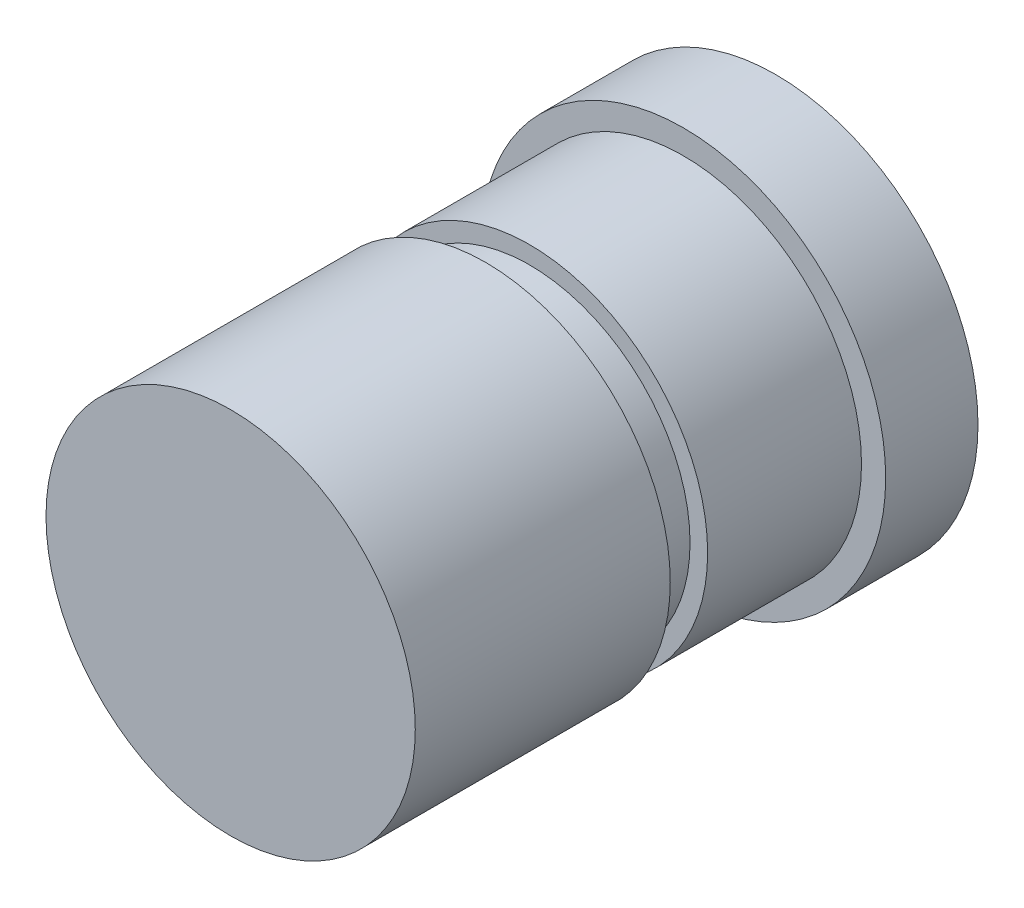
ISO-10303-21;
HEADER;
FILE_DESCRIPTION(('STEP AP214'),'2;1');
FILE_NAME('part.step','',(''),(''),'','','');
FILE_SCHEMA(('AUTOMOTIVE_DESIGN { 1 0 10303 214 1 1 1 1 }'));
ENDSEC;
DATA;
#1=APPLICATION_CONTEXT('core data for automotive mechanical design processes');
#2=APPLICATION_PROTOCOL_DEFINITION('international standard','automotive_design',2000,#1);
#3=PRODUCT_CONTEXT('',#1,'mechanical');
#4=PRODUCT('Part','Part','',(#3));
#5=PRODUCT_RELATED_PRODUCT_CATEGORY('part','',(#4));
#6=PRODUCT_DEFINITION_FORMATION('','',#4);
#7=PRODUCT_DEFINITION_CONTEXT('part definition',#1,'design');
#8=PRODUCT_DEFINITION('design','',#6,#7);
#9=PRODUCT_DEFINITION_SHAPE('','',#8);
#10=(LENGTH_UNIT() NAMED_UNIT(*) SI_UNIT(.MILLI.,.METRE.));
#11=(NAMED_UNIT(*) PLANE_ANGLE_UNIT() SI_UNIT($,.RADIAN.));
#12=(NAMED_UNIT(*) SI_UNIT($,.STERADIAN.) SOLID_ANGLE_UNIT());
#13=UNCERTAINTY_MEASURE_WITH_UNIT(LENGTH_MEASURE(1.E-05),#10,'distance_accuracy_value','');
#14=(GEOMETRIC_REPRESENTATION_CONTEXT(3) GLOBAL_UNCERTAINTY_ASSIGNED_CONTEXT((#13)) GLOBAL_UNIT_ASSIGNED_CONTEXT((#10,
#11,#12)) REPRESENTATION_CONTEXT('',''));
#15=CARTESIAN_POINT('',(0.,0.,0.));
#16=DIRECTION('',(0.,0.,1.));
#17=DIRECTION('',(1.,0.,0.));
#18=AXIS2_PLACEMENT_3D('',#15,#16,#17);
#19=CARTESIAN_POINT('',(0.,0.,11.6));
#20=DIRECTION('',(0.,0.,1.));
#21=DIRECTION('',(1.,0.,0.));
#22=AXIS2_PLACEMENT_3D('',#19,#20,#21);
#23=PLANE('',#22);
#24=CARTESIAN_POINT('',(0.,0.,11.6));
#25=DIRECTION('',(0.,0.,1.));
#26=DIRECTION('',(1.,0.,0.));
#27=AXIS2_PLACEMENT_3D('',#24,#25,#26);
#28=CIRCLE('',#27,2.6);
#29=CARTESIAN_POINT('',(2.6,0.,11.6));
#30=VERTEX_POINT('',#29);
#31=EDGE_CURVE('E17',#30,#30,#28,.F.);
#32=ORIENTED_EDGE('',*,*,#31,.T.);
#33=EDGE_LOOP('',(#32));
#34=FACE_BOUND('',#33,.T.);
#35=ADVANCED_FACE('F14',(#34),#23,.F.);
#36=CARTESIAN_POINT('',(0.,0.,3.3));
#37=DIRECTION('',(0.,0.,1.));
#38=DIRECTION('',(1.,0.,0.));
#39=AXIS2_PLACEMENT_3D('',#36,#37,#38);
#40=CYLINDRICAL_SURFACE('',#39,2.6);
#41=CARTESIAN_POINT('',(0.,0.,4.1000000003919));
#42=DIRECTION('',(0.,0.,-1.));
#43=DIRECTION('',(1.,0.,0.));
#44=AXIS2_PLACEMENT_3D('',#41,#42,#43);
#45=CIRCLE('',#44,2.60000000031368);
#46=CARTESIAN_POINT('',(2.60000000031368,0.,4.1000000003919));
#47=VERTEX_POINT('',#46);
#48=EDGE_CURVE('E56',#47,#47,#45,.T.);
#49=ORIENTED_EDGE('',*,*,#48,.T.);
#50=EDGE_LOOP('',(#49));
#51=FACE_BOUND('',#50,.T.);
#52=ORIENTED_EDGE('',*,*,#31,.F.);
#53=EDGE_LOOP('',(#52));
#54=FACE_BOUND('',#53,.T.);
#55=ADVANCED_FACE('F66',(#51,#54),#40,.F.);
#56=CARTESIAN_POINT('',(0.,0.,3.29999999956954));
#57=DIRECTION('',(0.,0.,-1.));
#58=DIRECTION('',(-1.,0.,0.));
#59=AXIS2_PLACEMENT_3D('',#56,#57,#58);
#60=CONICAL_SURFACE('',#59,3.39999999965812,0.78539816250927);
#61=CARTESIAN_POINT('',(0.,0.,3.29999999956954));
#62=DIRECTION('',(0.,0.,-1.));
#63=DIRECTION('',(-1.,0.,0.));
#64=AXIS2_PLACEMENT_3D('',#61,#62,#63);
#65=CIRCLE('',#64,3.39999999965812);
#66=CARTESIAN_POINT('',(-3.39999999965812,0.,3.29999999956954));
#67=VERTEX_POINT('',#66);
#68=EDGE_CURVE('E54',#67,#67,#65,.T.);
#69=ORIENTED_EDGE('',*,*,#68,.T.);
#70=EDGE_LOOP('',(#69));
#71=FACE_BOUND('',#70,.T.);
#72=ORIENTED_EDGE('',*,*,#48,.F.);
#73=EDGE_LOOP('',(#72));
#74=FACE_BOUND('',#73,.T.);
#75=ADVANCED_FACE('F68',(#71,#74),#60,.F.);
#76=CARTESIAN_POINT('',(0.,0.,3.3));
#77=DIRECTION('',(0.,0.,1.));
#78=DIRECTION('',(1.,0.,0.));
#79=AXIS2_PLACEMENT_3D('',#76,#77,#78);
#80=PLANE('',#79);
#81=ORIENTED_EDGE('',*,*,#68,.F.);
#82=EDGE_LOOP('',(#81));
#83=FACE_BOUND('',#82,.T.);
#84=CARTESIAN_POINT('',(0.,0.,3.3));
#85=DIRECTION('',(0.,0.,1.));
#86=DIRECTION('',(1.,0.,0.));
#87=AXIS2_PLACEMENT_3D('',#84,#85,#86);
#88=CIRCLE('',#87,3.6);
#89=CARTESIAN_POINT('',(3.6,0.,3.3));
#90=VERTEX_POINT('',#89);
#91=EDGE_CURVE('E52',#90,#90,#88,.F.);
#92=ORIENTED_EDGE('',*,*,#91,.T.);
#93=EDGE_LOOP('',(#92));
#94=FACE_BOUND('',#93,.T.);
#95=ADVANCED_FACE('F74',(#83,#94),#80,.F.);
#96=CARTESIAN_POINT('',(0.,0.,0.));
#97=DIRECTION('',(0.,0.,1.));
#98=DIRECTION('',(1.,0.,0.));
#99=AXIS2_PLACEMENT_3D('',#96,#97,#98);
#100=CYLINDRICAL_SURFACE('',#99,3.6);
#101=CARTESIAN_POINT('',(0.,0.,0.));
#102=DIRECTION('',(0.,0.,1.));
#103=DIRECTION('',(1.,0.,0.));
#104=AXIS2_PLACEMENT_3D('',#101,#102,#103);
#105=CIRCLE('',#104,3.6);
#106=CARTESIAN_POINT('',(3.6,0.,0.));
#107=VERTEX_POINT('',#106);
#108=EDGE_CURVE('E49',#107,#107,#105,.T.);
#109=ORIENTED_EDGE('',*,*,#108,.F.);
#110=EDGE_LOOP('',(#109));
#111=FACE_BOUND('',#110,.T.);
#112=ORIENTED_EDGE('',*,*,#91,.F.);
#113=EDGE_LOOP('',(#112));
#114=FACE_BOUND('',#113,.T.);
#115=ADVANCED_FACE('F114',(#111,#114),#100,.F.);
#116=CARTESIAN_POINT('',(0.,-2.3,0.));
#117=DIRECTION('',(0.,0.,-1.));
#118=DIRECTION('',(-1.,0.,0.));
#119=AXIS2_PLACEMENT_3D('',#116,#117,#118);
#120=PLANE('',#119);
#121=ORIENTED_EDGE('',*,*,#108,.T.);
#122=EDGE_LOOP('',(#121));
#123=FACE_BOUND('',#122,.T.);
#124=CARTESIAN_POINT('',(0.,0.,0.));
#125=DIRECTION('',(0.,0.,1.));
#126=DIRECTION('',(1.,0.,0.));
#127=AXIS2_PLACEMENT_3D('',#124,#125,#126);
#128=CIRCLE('',#127,4.6);
#129=CARTESIAN_POINT('',(4.6,0.,0.));
#130=VERTEX_POINT('',#129);
#131=EDGE_CURVE('E46',#130,#130,#128,.T.);
#132=ORIENTED_EDGE('',*,*,#131,.F.);
#133=EDGE_LOOP('',(#132));
#134=FACE_BOUND('',#133,.T.);
#135=ADVANCED_FACE('F110',(#123,#134),#120,.T.);
#136=CARTESIAN_POINT('',(0.,0.,1.05));
#137=DIRECTION('',(0.,0.,1.));
#138=DIRECTION('',(1.,0.,0.));
#139=AXIS2_PLACEMENT_3D('',#136,#137,#138);
#140=CYLINDRICAL_SURFACE('',#139,4.6);
#141=ORIENTED_EDGE('',*,*,#131,.T.);
#142=EDGE_LOOP('',(#141));
#143=FACE_BOUND('',#142,.T.);
#144=CARTESIAN_POINT('',(0.,0.,2.1));
#145=DIRECTION('',(0.,0.,1.));
#146=DIRECTION('',(1.,0.,0.));
#147=AXIS2_PLACEMENT_3D('',#144,#145,#146);
#148=CIRCLE('',#147,4.6);
#149=CARTESIAN_POINT('',(4.6,0.,2.1));
#150=VERTEX_POINT('',#149);
#151=EDGE_CURVE('E43',#150,#150,#148,.T.);
#152=ORIENTED_EDGE('',*,*,#151,.F.);
#153=EDGE_LOOP('',(#152));
#154=FACE_BOUND('',#153,.T.);
#155=ADVANCED_FACE('F106',(#143,#154),#140,.T.);
#156=CARTESIAN_POINT('',(0.,-4.325,2.1));
#157=DIRECTION('',(0.,0.,1.));
#158=DIRECTION('',(1.,0.,0.));
#159=AXIS2_PLACEMENT_3D('',#156,#157,#158);
#160=PLANE('',#159);
#161=CARTESIAN_POINT('',(0.,0.,2.1));
#162=DIRECTION('',(0.,0.,1.));
#163=DIRECTION('',(1.,0.,0.));
#164=AXIS2_PLACEMENT_3D('',#161,#162,#163);
#165=CIRCLE('',#164,4.05);
#166=CARTESIAN_POINT('',(4.05,0.,2.1));
#167=VERTEX_POINT('',#166);
#168=EDGE_CURVE('E40',#167,#167,#165,.T.);
#169=ORIENTED_EDGE('',*,*,#168,.F.);
#170=EDGE_LOOP('',(#169));
#171=FACE_BOUND('',#170,.T.);
#172=ORIENTED_EDGE('',*,*,#151,.T.);
#173=EDGE_LOOP('',(#172));
#174=FACE_BOUND('',#173,.T.);
#175=ADVANCED_FACE('F102',(#171,#174),#160,.T.);
#176=CARTESIAN_POINT('',(0.,0.,3.85));
#177=DIRECTION('',(0.,0.,1.));
#178=DIRECTION('',(1.,0.,0.));
#179=AXIS2_PLACEMENT_3D('',#176,#177,#178);
#180=CYLINDRICAL_SURFACE('',#179,4.05);
#181=ORIENTED_EDGE('',*,*,#168,.T.);
#182=EDGE_LOOP('',(#181));
#183=FACE_BOUND('',#182,.T.);
#184=CARTESIAN_POINT('',(0.,0.,5.6));
#185=DIRECTION('',(0.,0.,1.));
#186=DIRECTION('',(1.,0.,0.));
#187=AXIS2_PLACEMENT_3D('',#184,#185,#186);
#188=CIRCLE('',#187,4.05);
#189=CARTESIAN_POINT('',(4.05,0.,5.6));
#190=VERTEX_POINT('',#189);
#191=EDGE_CURVE('E37',#190,#190,#188,.T.);
#192=ORIENTED_EDGE('',*,*,#191,.F.);
#193=EDGE_LOOP('',(#192));
#194=FACE_BOUND('',#193,.T.);
#195=ADVANCED_FACE('F98',(#183,#194),#180,.T.);
#196=CARTESIAN_POINT('',(0.,-3.85,5.6));
#197=DIRECTION('',(0.,0.,1.));
#198=DIRECTION('',(1.,0.,0.));
#199=AXIS2_PLACEMENT_3D('',#196,#197,#198);
#200=PLANE('',#199);
#201=CARTESIAN_POINT('',(0.,0.,5.6));
#202=DIRECTION('',(0.,0.,1.));
#203=DIRECTION('',(1.,0.,0.));
#204=AXIS2_PLACEMENT_3D('',#201,#202,#203);
#205=CIRCLE('',#204,3.65);
#206=CARTESIAN_POINT('',(3.65,0.,5.6));
#207=VERTEX_POINT('',#206);
#208=EDGE_CURVE('E34',#207,#207,#205,.T.);
#209=ORIENTED_EDGE('',*,*,#208,.F.);
#210=EDGE_LOOP('',(#209));
#211=FACE_BOUND('',#210,.T.);
#212=ORIENTED_EDGE('',*,*,#191,.T.);
#213=EDGE_LOOP('',(#212));
#214=FACE_BOUND('',#213,.T.);
#215=ADVANCED_FACE('F94',(#211,#214),#200,.T.);
#216=CARTESIAN_POINT('',(0.,0.,6.1));
#217=DIRECTION('',(0.,0.,1.));
#218=DIRECTION('',(1.,0.,0.));
#219=AXIS2_PLACEMENT_3D('',#216,#217,#218);
#220=CYLINDRICAL_SURFACE('',#219,3.65);
#221=ORIENTED_EDGE('',*,*,#208,.T.);
#222=EDGE_LOOP('',(#221));
#223=FACE_BOUND('',#222,.T.);
#224=CARTESIAN_POINT('',(0.,0.,6.6));
#225=DIRECTION('',(0.,0.,1.));
#226=DIRECTION('',(1.,0.,0.));
#227=AXIS2_PLACEMENT_3D('',#224,#225,#226);
#228=CIRCLE('',#227,3.65);
#229=CARTESIAN_POINT('',(3.65,0.,6.6));
#230=VERTEX_POINT('',#229);
#231=EDGE_CURVE('E26',#230,#230,#228,.T.);
#232=ORIENTED_EDGE('',*,*,#231,.F.);
#233=EDGE_LOOP('',(#232));
#234=FACE_BOUND('',#233,.T.);
#235=ADVANCED_FACE('F90',(#223,#234),#220,.T.);
#236=CARTESIAN_POINT('',(0.,-2.1,12.4));
#237=DIRECTION('',(0.,0.,1.));
#238=DIRECTION('',(1.,0.,0.));
#239=AXIS2_PLACEMENT_3D('',#236,#237,#238);
#240=PLANE('',#239);
#241=CARTESIAN_POINT('',(0.,0.,12.4));
#242=DIRECTION('',(0.,0.,1.));
#243=DIRECTION('',(1.,0.,0.));
#244=AXIS2_PLACEMENT_3D('',#241,#242,#243);
#245=CIRCLE('',#244,4.2);
#246=CARTESIAN_POINT('',(4.2,0.,12.4));
#247=VERTEX_POINT('',#246);
#248=EDGE_CURVE('E21',#247,#247,#245,.F.);
#249=ORIENTED_EDGE('',*,*,#248,.F.);
#250=EDGE_LOOP('',(#249));
#251=FACE_BOUND('',#250,.T.);
#252=ADVANCED_FACE('F83',(#251),#240,.T.);
#253=CARTESIAN_POINT('',(0.,-3.925,6.6));
#254=DIRECTION('',(0.,0.,-1.));
#255=DIRECTION('',(-1.,0.,0.));
#256=AXIS2_PLACEMENT_3D('',#253,#254,#255);
#257=PLANE('',#256);
#258=ORIENTED_EDGE('',*,*,#231,.T.);
#259=EDGE_LOOP('',(#258));
#260=FACE_BOUND('',#259,.T.);
#261=CARTESIAN_POINT('',(0.,0.,6.6));
#262=DIRECTION('',(0.,0.,1.));
#263=DIRECTION('',(1.,0.,0.));
#264=AXIS2_PLACEMENT_3D('',#261,#262,#263);
#265=CIRCLE('',#264,4.2);
#266=CARTESIAN_POINT('',(4.2,0.,6.6));
#267=VERTEX_POINT('',#266);
#268=EDGE_CURVE('E10',#267,#267,#265,.T.);
#269=ORIENTED_EDGE('',*,*,#268,.F.);
#270=EDGE_LOOP('',(#269));
#271=FACE_BOUND('',#270,.T.);
#272=ADVANCED_FACE('F78',(#260,#271),#257,.T.);
#273=CARTESIAN_POINT('',(0.,0.,9.5));
#274=DIRECTION('',(0.,0.,1.));
#275=DIRECTION('',(1.,0.,0.));
#276=AXIS2_PLACEMENT_3D('',#273,#274,#275);
#277=CYLINDRICAL_SURFACE('',#276,4.2);
#278=ORIENTED_EDGE('',*,*,#268,.T.);
#279=EDGE_LOOP('',(#278));
#280=FACE_BOUND('',#279,.T.);
#281=ORIENTED_EDGE('',*,*,#248,.T.);
#282=EDGE_LOOP('',(#281));
#283=FACE_BOUND('',#282,.T.);
#284=ADVANCED_FACE('F76',(#280,#283),#277,.T.);
#285=CLOSED_SHELL('',(#35,#55,#75,#95,#115,#135,#155,#175,#195,#215,#235,#252,#272,#284));
#286=MANIFOLD_SOLID_BREP('B1',#285);
#287=ADVANCED_BREP_SHAPE_REPRESENTATION('',(#18,#286),#14);
#288=SHAPE_DEFINITION_REPRESENTATION(#9,#287);
ENDSEC;
END-ISO-10303-21;
